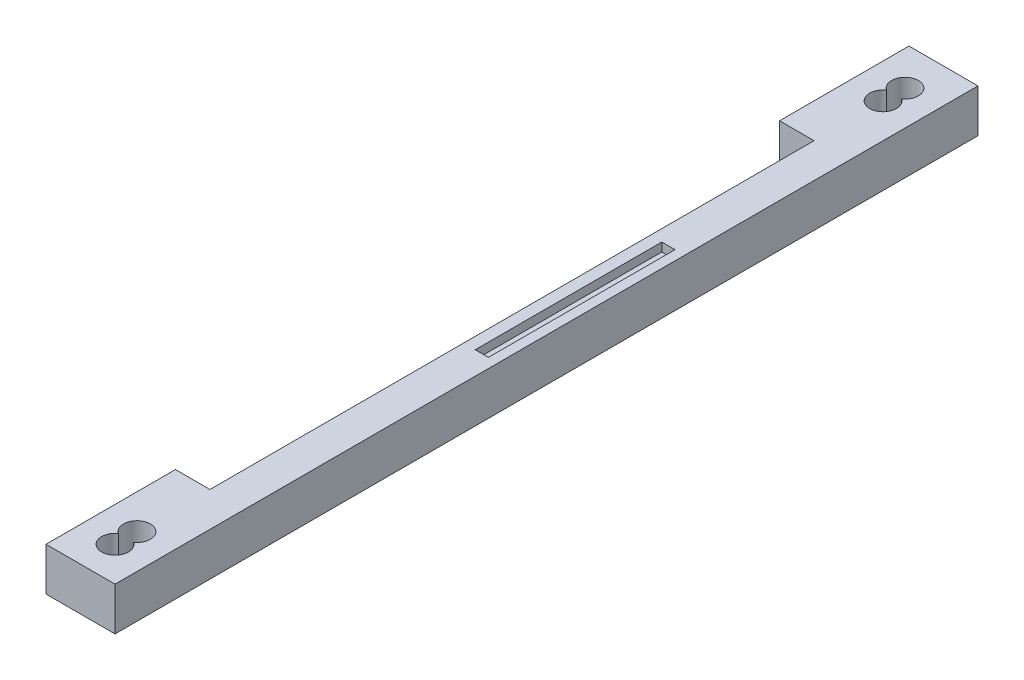
ISO-10303-21;
HEADER;
FILE_DESCRIPTION(('STEP AP214'),'2;1');
FILE_NAME('part.step','',(''),(''),'','','');
FILE_SCHEMA(('AUTOMOTIVE_DESIGN { 1 0 10303 214 1 1 1 1 }'));
ENDSEC;
DATA;
#1=APPLICATION_CONTEXT('core data for automotive mechanical design processes');
#2=APPLICATION_PROTOCOL_DEFINITION('international standard','automotive_design',2000,#1);
#3=PRODUCT_CONTEXT('',#1,'mechanical');
#4=PRODUCT('Part','Part','',(#3));
#5=PRODUCT_RELATED_PRODUCT_CATEGORY('part','',(#4));
#6=PRODUCT_DEFINITION_FORMATION('','',#4);
#7=PRODUCT_DEFINITION_CONTEXT('part definition',#1,'design');
#8=PRODUCT_DEFINITION('design','',#6,#7);
#9=PRODUCT_DEFINITION_SHAPE('','',#8);
#10=(LENGTH_UNIT() NAMED_UNIT(*) SI_UNIT(.MILLI.,.METRE.));
#11=(NAMED_UNIT(*) PLANE_ANGLE_UNIT() SI_UNIT($,.RADIAN.));
#12=(NAMED_UNIT(*) SI_UNIT($,.STERADIAN.) SOLID_ANGLE_UNIT());
#13=UNCERTAINTY_MEASURE_WITH_UNIT(LENGTH_MEASURE(1.E-05),#10,'distance_accuracy_value','');
#14=(GEOMETRIC_REPRESENTATION_CONTEXT(3) GLOBAL_UNCERTAINTY_ASSIGNED_CONTEXT((#13)) GLOBAL_UNIT_ASSIGNED_CONTEXT((#10,
#11,#12)) REPRESENTATION_CONTEXT('',''));
#15=CARTESIAN_POINT('',(0.,0.,0.));
#16=DIRECTION('',(0.,0.,1.));
#17=DIRECTION('',(1.,0.,0.));
#18=AXIS2_PLACEMENT_3D('',#15,#16,#17);
#19=CARTESIAN_POINT('',(-4.,5.,50.));
#20=DIRECTION('',(1.,0.,0.));
#21=DIRECTION('',(0.,0.,-1.));
#22=AXIS2_PLACEMENT_3D('',#19,#20,#21);
#23=PLANE('',#22);
#24=DIRECTION('',(0.,0.,1.));
#25=VECTOR('',#24,1.);
#26=CARTESIAN_POINT('',(-4.,0.,50.));
#27=LINE('',#26,#25);
#28=CARTESIAN_POINT('',(-4.,0.,-50.));
#29=VERTEX_POINT('',#28);
#30=CARTESIAN_POINT('',(-4.,0.,-35.));
#31=VERTEX_POINT('',#30);
#32=EDGE_CURVE('E275',#29,#31,#27,.T.);
#33=ORIENTED_EDGE('',*,*,#32,.T.);
#34=DIRECTION('',(0.,1.,0.));
#35=VECTOR('',#34,1.);
#36=CARTESIAN_POINT('',(-4.,0.,-35.));
#37=LINE('',#36,#35);
#38=CARTESIAN_POINT('',(-4.,5.,-35.));
#39=VERTEX_POINT('',#38);
#40=EDGE_CURVE('E217',#31,#39,#37,.T.);
#41=ORIENTED_EDGE('',*,*,#40,.T.);
#42=DIRECTION('',(0.,0.,1.));
#43=VECTOR('',#42,1.);
#44=CARTESIAN_POINT('',(-4.,5.,50.));
#45=LINE('',#44,#43);
#46=CARTESIAN_POINT('',(-4.,5.,-50.));
#47=VERTEX_POINT('',#46);
#48=EDGE_CURVE('E264',#47,#39,#45,.T.);
#49=ORIENTED_EDGE('',*,*,#48,.F.);
#50=DIRECTION('',(0.,-1.,0.));
#51=VECTOR('',#50,1.);
#52=CARTESIAN_POINT('',(-4.,5.,-50.));
#53=LINE('',#52,#51);
#54=EDGE_CURVE('E58',#47,#29,#53,.T.);
#55=ORIENTED_EDGE('',*,*,#54,.T.);
#56=EDGE_LOOP('',(#33,#41,#49,#55));
#57=FACE_BOUND('',#56,.T.);
#58=ADVANCED_FACE('F50',(#57),#23,.F.);
#59=CARTESIAN_POINT('',(4.,5.,50.));
#60=DIRECTION('',(-1.,0.,0.));
#61=DIRECTION('',(0.,0.,1.));
#62=AXIS2_PLACEMENT_3D('',#59,#60,#61);
#63=PLANE('',#62);
#64=DIRECTION('',(0.,0.,-1.));
#65=VECTOR('',#64,1.);
#66=CARTESIAN_POINT('',(4.,0.,50.));
#67=LINE('',#66,#65);
#68=CARTESIAN_POINT('',(4.,0.,50.));
#69=VERTEX_POINT('',#68);
#70=CARTESIAN_POINT('',(4.,0.,-50.));
#71=VERTEX_POINT('',#70);
#72=EDGE_CURVE('E254',#69,#71,#67,.T.);
#73=ORIENTED_EDGE('',*,*,#72,.T.);
#74=DIRECTION('',(0.,-1.,0.));
#75=VECTOR('',#74,1.);
#76=CARTESIAN_POINT('',(4.,5.,-50.));
#77=LINE('',#76,#75);
#78=CARTESIAN_POINT('',(4.,5.,-50.));
#79=VERTEX_POINT('',#78);
#80=EDGE_CURVE('E12',#79,#71,#77,.T.);
#81=ORIENTED_EDGE('',*,*,#80,.F.);
#82=DIRECTION('',(0.,0.,-1.));
#83=VECTOR('',#82,1.);
#84=CARTESIAN_POINT('',(4.,5.,50.));
#85=LINE('',#84,#83);
#86=CARTESIAN_POINT('',(4.,5.,50.));
#87=VERTEX_POINT('',#86);
#88=EDGE_CURVE('E257',#87,#79,#85,.T.);
#89=ORIENTED_EDGE('',*,*,#88,.F.);
#90=DIRECTION('',(0.,-1.,0.));
#91=VECTOR('',#90,1.);
#92=CARTESIAN_POINT('',(4.,5.,50.));
#93=LINE('',#92,#91);
#94=EDGE_CURVE('E269',#87,#69,#93,.T.);
#95=ORIENTED_EDGE('',*,*,#94,.T.);
#96=EDGE_LOOP('',(#73,#81,#89,#95));
#97=FACE_BOUND('',#96,.T.);
#98=ADVANCED_FACE('F52',(#97),#63,.F.);
#99=CARTESIAN_POINT('',(-4.,5.,-50.));
#100=DIRECTION('',(0.,0.,1.));
#101=DIRECTION('',(1.,0.,0.));
#102=AXIS2_PLACEMENT_3D('',#99,#100,#101);
#103=PLANE('',#102);
#104=DIRECTION('',(-1.,0.,0.));
#105=VECTOR('',#104,1.);
#106=CARTESIAN_POINT('',(-4.,0.,-50.));
#107=LINE('',#106,#105);
#108=EDGE_CURVE('E272',#71,#29,#107,.T.);
#109=ORIENTED_EDGE('',*,*,#108,.T.);
#110=ORIENTED_EDGE('',*,*,#54,.F.);
#111=DIRECTION('',(-1.,0.,0.));
#112=VECTOR('',#111,1.);
#113=CARTESIAN_POINT('',(-4.,5.,-50.));
#114=LINE('',#113,#112);
#115=EDGE_CURVE('E260',#79,#47,#114,.T.);
#116=ORIENTED_EDGE('',*,*,#115,.F.);
#117=ORIENTED_EDGE('',*,*,#80,.T.);
#118=EDGE_LOOP('',(#109,#110,#116,#117));
#119=FACE_BOUND('',#118,.T.);
#120=ADVANCED_FACE('F302',(#119),#103,.F.);
#121=CARTESIAN_POINT('',(-3.99999999999999,5.,35.));
#122=VERTEX_POINT('',#121);
#123=CARTESIAN_POINT('',(-4.,5.,50.));
#124=VERTEX_POINT('',#123);
#125=EDGE_CURVE('E263',#122,#124,#45,.T.);
#126=ORIENTED_EDGE('',*,*,#125,.F.);
#127=DIRECTION('',(0.,1.,0.));
#128=VECTOR('',#127,1.);
#129=CARTESIAN_POINT('',(-3.99999999999999,0.,35.));
#130=LINE('',#129,#128);
#131=CARTESIAN_POINT('',(-3.99999999999999,0.,35.));
#132=VERTEX_POINT('',#131);
#133=EDGE_CURVE('E210',#132,#122,#130,.T.);
#134=ORIENTED_EDGE('',*,*,#133,.F.);
#135=CARTESIAN_POINT('',(-4.,0.,50.));
#136=VERTEX_POINT('',#135);
#137=EDGE_CURVE('E274',#132,#136,#27,.T.);
#138=ORIENTED_EDGE('',*,*,#137,.T.);
#139=DIRECTION('',(0.,-1.,0.));
#140=VECTOR('',#139,1.);
#141=CARTESIAN_POINT('',(-4.,5.,50.));
#142=LINE('',#141,#140);
#143=EDGE_CURVE('E281',#124,#136,#142,.T.);
#144=ORIENTED_EDGE('',*,*,#143,.F.);
#145=EDGE_LOOP('',(#126,#134,#138,#144));
#146=FACE_BOUND('',#145,.T.);
#147=ADVANCED_FACE('F313',(#146),#23,.F.);
#148=CARTESIAN_POINT('',(-4.,5.,50.));
#149=DIRECTION('',(0.,0.,-1.));
#150=DIRECTION('',(-1.,0.,0.));
#151=AXIS2_PLACEMENT_3D('',#148,#149,#150);
#152=PLANE('',#151);
#153=DIRECTION('',(1.,0.,0.));
#154=VECTOR('',#153,1.);
#155=CARTESIAN_POINT('',(-4.,0.,50.));
#156=LINE('',#155,#154);
#157=EDGE_CURVE('E261',#136,#69,#156,.T.);
#158=ORIENTED_EDGE('',*,*,#157,.T.);
#159=ORIENTED_EDGE('',*,*,#94,.F.);
#160=DIRECTION('',(1.,0.,0.));
#161=VECTOR('',#160,1.);
#162=CARTESIAN_POINT('',(-4.,5.,50.));
#163=LINE('',#162,#161);
#164=EDGE_CURVE('E267',#124,#87,#163,.T.);
#165=ORIENTED_EDGE('',*,*,#164,.F.);
#166=ORIENTED_EDGE('',*,*,#143,.T.);
#167=EDGE_LOOP('',(#158,#159,#165,#166));
#168=FACE_BOUND('',#167,.T.);
#169=ADVANCED_FACE('F308',(#168),#152,.F.);
#170=CARTESIAN_POINT('',(0.,5.,0.));
#171=DIRECTION('',(0.,-1.,0.));
#172=DIRECTION('',(0.,0.,-1.));
#173=AXIS2_PLACEMENT_3D('',#170,#171,#172);
#174=PLANE('',#173);
#175=DIRECTION('',(-1.,0.,0.));
#176=VECTOR('',#175,1.);
#177=CARTESIAN_POINT('',(2.87787692469349,5.,-16.0106361223445));
#178=LINE('',#177,#176);
#179=CARTESIAN_POINT('',(2.87787692469349,5.,-16.0106361223445));
#180=VERTEX_POINT('',#179);
#181=CARTESIAN_POINT('',(1.3473605670065,5.,-16.0106361223445));
#182=VERTEX_POINT('',#181);
#183=EDGE_CURVE('E192',#180,#182,#178,.T.);
#184=ORIENTED_EDGE('',*,*,#183,.F.);
#185=DIRECTION('',(0.,0.,-1.));
#186=VECTOR('',#185,1.);
#187=CARTESIAN_POINT('',(2.87787692469349,5.,5.60790742998434));
#188=LINE('',#187,#186);
#189=CARTESIAN_POINT('',(2.87787692469349,5.,5.60790742998434));
#190=VERTEX_POINT('',#189);
#191=EDGE_CURVE('E65',#190,#180,#188,.T.);
#192=ORIENTED_EDGE('',*,*,#191,.F.);
#193=DIRECTION('',(1.,0.,0.));
#194=VECTOR('',#193,1.);
#195=CARTESIAN_POINT('',(2.87787692469349,5.,5.60790742998434));
#196=LINE('',#195,#194);
#197=CARTESIAN_POINT('',(1.3473605670065,5.,5.60790742998434));
#198=VERTEX_POINT('',#197);
#199=EDGE_CURVE('E183',#198,#190,#196,.T.);
#200=ORIENTED_EDGE('',*,*,#199,.F.);
#201=DIRECTION('',(0.,0.,1.));
#202=VECTOR('',#201,1.);
#203=CARTESIAN_POINT('',(1.3473605670065,5.,5.60790742998434));
#204=LINE('',#203,#202);
#205=EDGE_CURVE('E186',#182,#198,#204,.T.);
#206=ORIENTED_EDGE('',*,*,#205,.F.);
#207=EDGE_LOOP('',(#184,#192,#200,#206));
#208=FACE_BOUND('',#207,.T.);
#209=CARTESIAN_POINT('',(0.,5.,-45.5399999999999));
#210=DIRECTION('',(0.,1.,0.));
#211=DIRECTION('',(0.,0.,1.));
#212=AXIS2_PLACEMENT_3D('',#209,#210,#211);
#213=CIRCLE('',#212,1.55);
#214=CARTESIAN_POINT('',(0.888594395660924,5.,-44.2699999999999));
#215=VERTEX_POINT('',#214);
#216=CARTESIAN_POINT('',(-0.888594395660923,5.,-44.2699999999999));
#217=VERTEX_POINT('',#216);
#218=EDGE_CURVE('E235',#215,#217,#213,.T.);
#219=ORIENTED_EDGE('',*,*,#218,.F.);
#220=CARTESIAN_POINT('',(0.,5.,-42.9999999999999));
#221=DIRECTION('',(0.,1.,0.));
#222=DIRECTION('',(0.,0.,1.));
#223=AXIS2_PLACEMENT_3D('',#220,#221,#222);
#224=CIRCLE('',#223,1.55);
#225=EDGE_CURVE('E230',#217,#215,#224,.T.);
#226=ORIENTED_EDGE('',*,*,#225,.F.);
#227=EDGE_LOOP('',(#219,#226));
#228=FACE_BOUND('',#227,.T.);
#229=CARTESIAN_POINT('',(0.,5.,46.));
#230=DIRECTION('',(0.,1.,0.));
#231=DIRECTION('',(0.,0.,1.));
#232=AXIS2_PLACEMENT_3D('',#229,#230,#231);
#233=CIRCLE('',#232,1.55);
#234=CARTESIAN_POINT('',(-0.888594395660923,5.,44.73));
#235=VERTEX_POINT('',#234);
#236=CARTESIAN_POINT('',(0.888594395660923,5.,44.73));
#237=VERTEX_POINT('',#236);
#238=EDGE_CURVE('E242',#235,#237,#233,.T.);
#239=ORIENTED_EDGE('',*,*,#238,.F.);
#240=CARTESIAN_POINT('',(0.,5.,43.4600000000001));
#241=DIRECTION('',(0.,1.,0.));
#242=DIRECTION('',(0.,0.,1.));
#243=AXIS2_PLACEMENT_3D('',#240,#241,#242);
#244=CIRCLE('',#243,1.55);
#245=EDGE_CURVE('E238',#237,#235,#244,.T.);
#246=ORIENTED_EDGE('',*,*,#245,.F.);
#247=EDGE_LOOP('',(#239,#246));
#248=FACE_BOUND('',#247,.T.);
#249=ORIENTED_EDGE('',*,*,#48,.T.);
#250=DIRECTION('',(-1.,0.,0.));
#251=VECTOR('',#250,1.);
#252=CARTESIAN_POINT('',(-4.,5.,-35.));
#253=LINE('',#252,#251);
#254=CARTESIAN_POINT('',(0.,5.,-35.));
#255=VERTEX_POINT('',#254);
#256=EDGE_CURVE('E205',#255,#39,#253,.T.);
#257=ORIENTED_EDGE('',*,*,#256,.F.);
#258=DIRECTION('',(0.,0.,-1.));
#259=VECTOR('',#258,1.);
#260=CARTESIAN_POINT('',(0.,5.,-35.));
#261=LINE('',#260,#259);
#262=CARTESIAN_POINT('',(0.,5.,35.));
#263=VERTEX_POINT('',#262);
#264=EDGE_CURVE('E213',#263,#255,#261,.T.);
#265=ORIENTED_EDGE('',*,*,#264,.F.);
#266=DIRECTION('',(1.,0.,0.));
#267=VECTOR('',#266,1.);
#268=CARTESIAN_POINT('',(-3.99999999999999,5.,35.));
#269=LINE('',#268,#267);
#270=EDGE_CURVE('E198',#122,#263,#269,.T.);
#271=ORIENTED_EDGE('',*,*,#270,.F.);
#272=ORIENTED_EDGE('',*,*,#125,.T.);
#273=ORIENTED_EDGE('',*,*,#164,.T.);
#274=ORIENTED_EDGE('',*,*,#88,.T.);
#275=ORIENTED_EDGE('',*,*,#115,.T.);
#276=EDGE_LOOP('',(#249,#257,#265,#271,#272,#273,#274,#275));
#277=FACE_BOUND('',#276,.T.);
#278=ADVANCED_FACE('F298',(#208,#228,#248,#277),#174,.F.);
#279=CARTESIAN_POINT('',(0.,0.,0.));
#280=DIRECTION('',(0.,-1.,0.));
#281=DIRECTION('',(0.,0.,-1.));
#282=AXIS2_PLACEMENT_3D('',#279,#280,#281);
#283=PLANE('',#282);
#284=DIRECTION('',(-1.,0.,0.));
#285=VECTOR('',#284,1.);
#286=CARTESIAN_POINT('',(-4.,0.,-35.));
#287=LINE('',#286,#285);
#288=CARTESIAN_POINT('',(0.,0.,-35.));
#289=VERTEX_POINT('',#288);
#290=EDGE_CURVE('E207',#289,#31,#287,.T.);
#291=ORIENTED_EDGE('',*,*,#290,.T.);
#292=ORIENTED_EDGE('',*,*,#32,.F.);
#293=ORIENTED_EDGE('',*,*,#108,.F.);
#294=ORIENTED_EDGE('',*,*,#72,.F.);
#295=ORIENTED_EDGE('',*,*,#157,.F.);
#296=ORIENTED_EDGE('',*,*,#137,.F.);
#297=DIRECTION('',(1.,0.,0.));
#298=VECTOR('',#297,1.);
#299=CARTESIAN_POINT('',(-3.99999999999999,0.,35.));
#300=LINE('',#299,#298);
#301=CARTESIAN_POINT('',(0.,0.,35.));
#302=VERTEX_POINT('',#301);
#303=EDGE_CURVE('E202',#132,#302,#300,.T.);
#304=ORIENTED_EDGE('',*,*,#303,.T.);
#305=DIRECTION('',(0.,0.,-1.));
#306=VECTOR('',#305,1.);
#307=CARTESIAN_POINT('',(0.,0.,-35.));
#308=LINE('',#307,#306);
#309=EDGE_CURVE('E73',#302,#289,#308,.T.);
#310=ORIENTED_EDGE('',*,*,#309,.T.);
#311=EDGE_LOOP('',(#291,#292,#293,#294,#295,#296,#304,#310));
#312=FACE_BOUND('',#311,.T.);
#313=CARTESIAN_POINT('',(0.,0.,-42.9999999999999));
#314=DIRECTION('',(0.,1.,0.));
#315=DIRECTION('',(0.,0.,1.));
#316=AXIS2_PLACEMENT_3D('',#313,#314,#315);
#317=CIRCLE('',#316,1.55);
#318=CARTESIAN_POINT('',(-0.888594395660924,0.,-44.2699999999999));
#319=VERTEX_POINT('',#318);
#320=CARTESIAN_POINT('',(0.888594395660923,0.,-44.2699999999999));
#321=VERTEX_POINT('',#320);
#322=EDGE_CURVE('E226',#319,#321,#317,.T.);
#323=ORIENTED_EDGE('',*,*,#322,.T.);
#324=CARTESIAN_POINT('',(0.,0.,-45.5399999999999));
#325=DIRECTION('',(0.,1.,0.));
#326=DIRECTION('',(0.,0.,1.));
#327=AXIS2_PLACEMENT_3D('',#324,#325,#326);
#328=CIRCLE('',#327,1.55);
#329=EDGE_CURVE('E232',#321,#319,#328,.T.);
#330=ORIENTED_EDGE('',*,*,#329,.T.);
#331=EDGE_LOOP('',(#323,#330));
#332=FACE_BOUND('',#331,.T.);
#333=CARTESIAN_POINT('',(0.,0.,43.4600000000001));
#334=DIRECTION('',(0.,1.,0.));
#335=DIRECTION('',(0.,0.,1.));
#336=AXIS2_PLACEMENT_3D('',#333,#334,#335);
#337=CIRCLE('',#336,1.55);
#338=CARTESIAN_POINT('',(0.888594395660924,0.,44.73));
#339=VERTEX_POINT('',#338);
#340=CARTESIAN_POINT('',(-0.888594395660923,0.,44.73));
#341=VERTEX_POINT('',#340);
#342=EDGE_CURVE('E244',#339,#341,#337,.T.);
#343=ORIENTED_EDGE('',*,*,#342,.T.);
#344=CARTESIAN_POINT('',(0.,0.,46.));
#345=DIRECTION('',(0.,1.,0.));
#346=DIRECTION('',(0.,0.,1.));
#347=AXIS2_PLACEMENT_3D('',#344,#345,#346);
#348=CIRCLE('',#347,1.55);
#349=EDGE_CURVE('E251',#341,#339,#348,.T.);
#350=ORIENTED_EDGE('',*,*,#349,.T.);
#351=EDGE_LOOP('',(#343,#350));
#352=FACE_BOUND('',#351,.T.);
#353=ADVANCED_FACE('F290',(#312,#332,#352),#283,.T.);
#354=CARTESIAN_POINT('',(0.,0.,46.));
#355=DIRECTION('',(0.,1.,0.));
#356=DIRECTION('',(0.,0.,1.));
#357=AXIS2_PLACEMENT_3D('',#354,#355,#356);
#358=CYLINDRICAL_SURFACE('',#357,1.55);
#359=ORIENTED_EDGE('',*,*,#349,.F.);
#360=DIRECTION('',(0.,1.,0.));
#361=VECTOR('',#360,1.);
#362=CARTESIAN_POINT('',(-0.888594395660923,0.,44.73));
#363=LINE('',#362,#361);
#364=EDGE_CURVE('E247',#341,#235,#363,.T.);
#365=ORIENTED_EDGE('',*,*,#364,.T.);
#366=ORIENTED_EDGE('',*,*,#238,.T.);
#367=DIRECTION('',(0.,1.,0.));
#368=VECTOR('',#367,1.);
#369=CARTESIAN_POINT('',(0.888594395660923,0.,44.73));
#370=LINE('',#369,#368);
#371=EDGE_CURVE('E220',#339,#237,#370,.T.);
#372=ORIENTED_EDGE('',*,*,#371,.F.);
#373=EDGE_LOOP('',(#359,#365,#366,#372));
#374=FACE_BOUND('',#373,.T.);
#375=ADVANCED_FACE('F377',(#374),#358,.F.);
#376=CARTESIAN_POINT('',(0.,0.,43.4600000000001));
#377=DIRECTION('',(0.,1.,0.));
#378=DIRECTION('',(0.,0.,1.));
#379=AXIS2_PLACEMENT_3D('',#376,#377,#378);
#380=CYLINDRICAL_SURFACE('',#379,1.55);
#381=ORIENTED_EDGE('',*,*,#364,.F.);
#382=ORIENTED_EDGE('',*,*,#342,.F.);
#383=ORIENTED_EDGE('',*,*,#371,.T.);
#384=ORIENTED_EDGE('',*,*,#245,.T.);
#385=EDGE_LOOP('',(#381,#382,#383,#384));
#386=FACE_BOUND('',#385,.T.);
#387=ADVANCED_FACE('F385',(#386),#380,.F.);
#388=CARTESIAN_POINT('',(0.,0.,-42.9999999999999));
#389=DIRECTION('',(0.,1.,0.));
#390=DIRECTION('',(0.,0.,1.));
#391=AXIS2_PLACEMENT_3D('',#388,#389,#390);
#392=CYLINDRICAL_SURFACE('',#391,1.55);
#393=DIRECTION('',(0.,1.,0.));
#394=VECTOR('',#393,1.);
#395=CARTESIAN_POINT('',(-0.888594395660924,2.5,-44.2699999999999));
#396=LINE('',#395,#394);
#397=EDGE_CURVE('E240',#319,#217,#396,.T.);
#398=ORIENTED_EDGE('',*,*,#397,.T.);
#399=ORIENTED_EDGE('',*,*,#225,.T.);
#400=DIRECTION('',(0.,1.,0.));
#401=VECTOR('',#400,1.);
#402=CARTESIAN_POINT('',(0.888594395660924,2.5,-44.2699999999999));
#403=LINE('',#402,#401);
#404=EDGE_CURVE('E229',#215,#321,#403,.F.);
#405=ORIENTED_EDGE('',*,*,#404,.T.);
#406=ORIENTED_EDGE('',*,*,#322,.F.);
#407=EDGE_LOOP('',(#398,#399,#405,#406));
#408=FACE_BOUND('',#407,.T.);
#409=ADVANCED_FACE('F394',(#408),#392,.F.);
#410=CARTESIAN_POINT('',(0.,0.,-45.5399999999999));
#411=DIRECTION('',(0.,1.,0.));
#412=DIRECTION('',(0.,0.,1.));
#413=AXIS2_PLACEMENT_3D('',#410,#411,#412);
#414=CYLINDRICAL_SURFACE('',#413,1.55);
#415=ORIENTED_EDGE('',*,*,#329,.F.);
#416=ORIENTED_EDGE('',*,*,#404,.F.);
#417=ORIENTED_EDGE('',*,*,#218,.T.);
#418=ORIENTED_EDGE('',*,*,#397,.F.);
#419=EDGE_LOOP('',(#415,#416,#417,#418));
#420=FACE_BOUND('',#419,.T.);
#421=ADVANCED_FACE('F326',(#420),#414,.F.);
#422=CARTESIAN_POINT('',(-4.,0.,-35.));
#423=DIRECTION('',(0.,0.,-1.));
#424=DIRECTION('',(-1.,0.,0.));
#425=AXIS2_PLACEMENT_3D('',#422,#423,#424);
#426=PLANE('',#425);
#427=ORIENTED_EDGE('',*,*,#256,.T.);
#428=ORIENTED_EDGE('',*,*,#40,.F.);
#429=ORIENTED_EDGE('',*,*,#290,.F.);
#430=DIRECTION('',(0.,1.,0.));
#431=VECTOR('',#430,1.);
#432=CARTESIAN_POINT('',(0.,0.,-35.));
#433=LINE('',#432,#431);
#434=EDGE_CURVE('E221',#289,#255,#433,.T.);
#435=ORIENTED_EDGE('',*,*,#434,.T.);
#436=EDGE_LOOP('',(#427,#428,#429,#435));
#437=FACE_BOUND('',#436,.T.);
#438=ADVANCED_FACE('F295',(#437),#426,.F.);
#439=CARTESIAN_POINT('',(0.,0.,-35.));
#440=DIRECTION('',(1.,0.,0.));
#441=DIRECTION('',(0.,0.,-1.));
#442=AXIS2_PLACEMENT_3D('',#439,#440,#441);
#443=PLANE('',#442);
#444=ORIENTED_EDGE('',*,*,#264,.T.);
#445=ORIENTED_EDGE('',*,*,#434,.F.);
#446=ORIENTED_EDGE('',*,*,#309,.F.);
#447=DIRECTION('',(0.,1.,0.));
#448=VECTOR('',#447,1.);
#449=CARTESIAN_POINT('',(0.,0.,35.));
#450=LINE('',#449,#448);
#451=EDGE_CURVE('E223',#302,#263,#450,.T.);
#452=ORIENTED_EDGE('',*,*,#451,.T.);
#453=EDGE_LOOP('',(#444,#445,#446,#452));
#454=FACE_BOUND('',#453,.T.);
#455=ADVANCED_FACE('F318',(#454),#443,.F.);
#456=CARTESIAN_POINT('',(-3.99999999999999,0.,35.));
#457=DIRECTION('',(0.,0.,1.));
#458=DIRECTION('',(1.,0.,0.));
#459=AXIS2_PLACEMENT_3D('',#456,#457,#458);
#460=PLANE('',#459);
#461=ORIENTED_EDGE('',*,*,#270,.T.);
#462=ORIENTED_EDGE('',*,*,#451,.F.);
#463=ORIENTED_EDGE('',*,*,#303,.F.);
#464=ORIENTED_EDGE('',*,*,#133,.T.);
#465=EDGE_LOOP('',(#461,#462,#463,#464));
#466=FACE_BOUND('',#465,.T.);
#467=ADVANCED_FACE('F317',(#466),#460,.F.);
#468=CARTESIAN_POINT('',(2.87787692469349,4.,5.60790742998434));
#469=DIRECTION('',(1.,0.,0.));
#470=DIRECTION('',(0.,0.,-1.));
#471=AXIS2_PLACEMENT_3D('',#468,#469,#470);
#472=PLANE('',#471);
#473=ORIENTED_EDGE('',*,*,#191,.T.);
#474=DIRECTION('',(0.,1.,0.));
#475=VECTOR('',#474,1.);
#476=CARTESIAN_POINT('',(2.87787692469349,4.,-16.0106361223445));
#477=LINE('',#476,#475);
#478=CARTESIAN_POINT('',(2.87787692469349,4.,-16.0106361223445));
#479=VERTEX_POINT('',#478);
#480=EDGE_CURVE('E161',#479,#180,#477,.T.);
#481=ORIENTED_EDGE('',*,*,#480,.F.);
#482=DIRECTION('',(0.,0.,-1.));
#483=VECTOR('',#482,1.);
#484=CARTESIAN_POINT('',(2.87787692469349,4.,5.60790742998434));
#485=LINE('',#484,#483);
#486=CARTESIAN_POINT('',(2.87787692469349,4.,5.60790742998434));
#487=VERTEX_POINT('',#486);
#488=EDGE_CURVE('E165',#487,#479,#485,.T.);
#489=ORIENTED_EDGE('',*,*,#488,.F.);
#490=DIRECTION('',(0.,1.,0.));
#491=VECTOR('',#490,1.);
#492=CARTESIAN_POINT('',(2.87787692469349,4.,5.60790742998434));
#493=LINE('',#492,#491);
#494=EDGE_CURVE('E196',#487,#190,#493,.T.);
#495=ORIENTED_EDGE('',*,*,#494,.T.);
#496=EDGE_LOOP('',(#473,#481,#489,#495));
#497=FACE_BOUND('',#496,.T.);
#498=ADVANCED_FACE('F163',(#497),#472,.F.);
#499=CARTESIAN_POINT('',(2.87787692469349,4.,5.60790742998434));
#500=DIRECTION('',(0.,0.,1.));
#501=DIRECTION('',(1.,0.,0.));
#502=AXIS2_PLACEMENT_3D('',#499,#500,#501);
#503=PLANE('',#502);
#504=ORIENTED_EDGE('',*,*,#199,.T.);
#505=ORIENTED_EDGE('',*,*,#494,.F.);
#506=DIRECTION('',(1.,0.,0.));
#507=VECTOR('',#506,1.);
#508=CARTESIAN_POINT('',(2.87787692469349,4.,5.60790742998434));
#509=LINE('',#508,#507);
#510=CARTESIAN_POINT('',(1.3473605670065,4.,5.60790742998434));
#511=VERTEX_POINT('',#510);
#512=EDGE_CURVE('E171',#511,#487,#509,.T.);
#513=ORIENTED_EDGE('',*,*,#512,.F.);
#514=DIRECTION('',(0.,1.,0.));
#515=VECTOR('',#514,1.);
#516=CARTESIAN_POINT('',(1.3473605670065,4.,5.60790742998434));
#517=LINE('',#516,#515);
#518=EDGE_CURVE('E199',#511,#198,#517,.T.);
#519=ORIENTED_EDGE('',*,*,#518,.T.);
#520=EDGE_LOOP('',(#504,#505,#513,#519));
#521=FACE_BOUND('',#520,.T.);
#522=ADVANCED_FACE('F434',(#521),#503,.F.);
#523=CARTESIAN_POINT('',(1.3473605670065,4.,5.60790742998434));
#524=DIRECTION('',(-1.,0.,0.));
#525=DIRECTION('',(0.,0.,1.));
#526=AXIS2_PLACEMENT_3D('',#523,#524,#525);
#527=PLANE('',#526);
#528=ORIENTED_EDGE('',*,*,#205,.T.);
#529=ORIENTED_EDGE('',*,*,#518,.F.);
#530=DIRECTION('',(0.,0.,1.));
#531=VECTOR('',#530,1.);
#532=CARTESIAN_POINT('',(1.3473605670065,4.,5.60790742998434));
#533=LINE('',#532,#531);
#534=CARTESIAN_POINT('',(1.3473605670065,4.,-16.0106361223445));
#535=VERTEX_POINT('',#534);
#536=EDGE_CURVE('E179',#535,#511,#533,.T.);
#537=ORIENTED_EDGE('',*,*,#536,.F.);
#538=DIRECTION('',(0.,1.,0.));
#539=VECTOR('',#538,1.);
#540=CARTESIAN_POINT('',(1.3473605670065,4.,-16.0106361223445));
#541=LINE('',#540,#539);
#542=EDGE_CURVE('E170',#535,#182,#541,.T.);
#543=ORIENTED_EDGE('',*,*,#542,.T.);
#544=EDGE_LOOP('',(#528,#529,#537,#543));
#545=FACE_BOUND('',#544,.T.);
#546=ADVANCED_FACE('F442',(#545),#527,.F.);
#547=CARTESIAN_POINT('',(2.87787692469349,4.,-16.0106361223445));
#548=DIRECTION('',(0.,0.,-1.));
#549=DIRECTION('',(-1.,0.,0.));
#550=AXIS2_PLACEMENT_3D('',#547,#548,#549);
#551=PLANE('',#550);
#552=ORIENTED_EDGE('',*,*,#183,.T.);
#553=ORIENTED_EDGE('',*,*,#542,.F.);
#554=DIRECTION('',(-1.,0.,0.));
#555=VECTOR('',#554,1.);
#556=CARTESIAN_POINT('',(2.87787692469349,4.,-16.0106361223445));
#557=LINE('',#556,#555);
#558=EDGE_CURVE('E174',#479,#535,#557,.T.);
#559=ORIENTED_EDGE('',*,*,#558,.F.);
#560=ORIENTED_EDGE('',*,*,#480,.T.);
#561=EDGE_LOOP('',(#552,#553,#559,#560));
#562=FACE_BOUND('',#561,.T.);
#563=ADVANCED_FACE('F175',(#562),#551,.F.);
#564=CARTESIAN_POINT('',(0.,4.,0.));
#565=DIRECTION('',(0.,1.,0.));
#566=DIRECTION('',(0.,0.,1.));
#567=AXIS2_PLACEMENT_3D('',#564,#565,#566);
#568=PLANE('',#567);
#569=ORIENTED_EDGE('',*,*,#488,.T.);
#570=ORIENTED_EDGE('',*,*,#558,.T.);
#571=ORIENTED_EDGE('',*,*,#536,.T.);
#572=ORIENTED_EDGE('',*,*,#512,.T.);
#573=EDGE_LOOP('',(#569,#570,#571,#572));
#574=FACE_BOUND('',#573,.T.);
#575=ADVANCED_FACE('F181',(#574),#568,.T.);
#576=CLOSED_SHELL('',(#58,#98,#120,#147,#169,#278,#353,#375,#387,#409,#421,#438,#455,#467,#498,
#522,#546,#563,#575));
#577=MANIFOLD_SOLID_BREP('B2',#576);
#578=ADVANCED_BREP_SHAPE_REPRESENTATION('',(#18,#577),#14);
#579=SHAPE_DEFINITION_REPRESENTATION(#9,#578);
ENDSEC;
END-ISO-10303-21;
